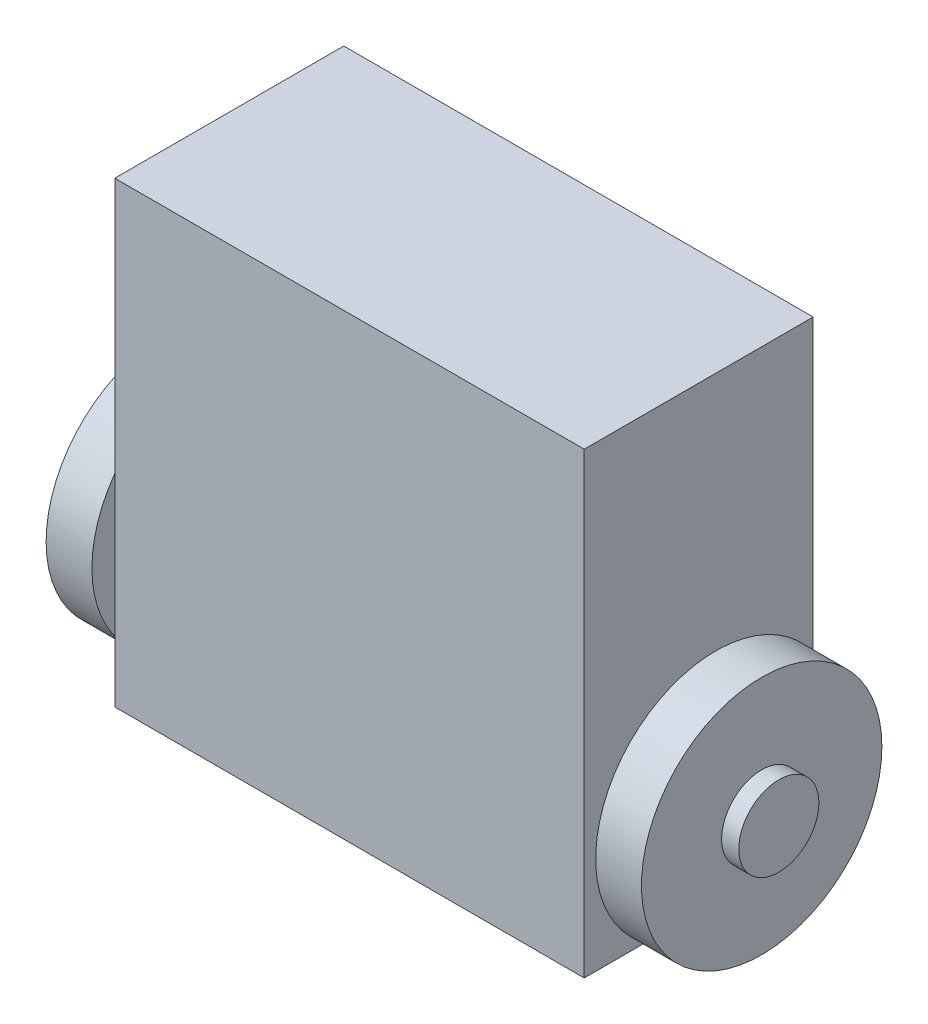
ISO-10303-21;
HEADER;
FILE_DESCRIPTION(('STEP AP214'),'2;1');
FILE_NAME('part.step','',(''),(''),'','','');
FILE_SCHEMA(('AUTOMOTIVE_DESIGN { 1 0 10303 214 1 1 1 1 }'));
ENDSEC;
DATA;
#1=APPLICATION_CONTEXT('core data for automotive mechanical design processes');
#2=APPLICATION_PROTOCOL_DEFINITION('international standard','automotive_design',2000,#1);
#3=PRODUCT_CONTEXT('',#1,'mechanical');
#4=PRODUCT('Part','Part','',(#3));
#5=PRODUCT_RELATED_PRODUCT_CATEGORY('part','',(#4));
#6=PRODUCT_DEFINITION_FORMATION('','',#4);
#7=PRODUCT_DEFINITION_CONTEXT('part definition',#1,'design');
#8=PRODUCT_DEFINITION('design','',#6,#7);
#9=PRODUCT_DEFINITION_SHAPE('','',#8);
#10=(LENGTH_UNIT() NAMED_UNIT(*) SI_UNIT(.MILLI.,.METRE.));
#11=(NAMED_UNIT(*) PLANE_ANGLE_UNIT() SI_UNIT($,.RADIAN.));
#12=(NAMED_UNIT(*) SI_UNIT($,.STERADIAN.) SOLID_ANGLE_UNIT());
#13=UNCERTAINTY_MEASURE_WITH_UNIT(LENGTH_MEASURE(1.E-05),#10,'distance_accuracy_value','');
#14=(GEOMETRIC_REPRESENTATION_CONTEXT(3) GLOBAL_UNCERTAINTY_ASSIGNED_CONTEXT((#13)) GLOBAL_UNIT_ASSIGNED_CONTEXT((#10,
#11,#12)) REPRESENTATION_CONTEXT('',''));
#15=CARTESIAN_POINT('',(0.,0.,0.));
#16=DIRECTION('',(0.,0.,1.));
#17=DIRECTION('',(1.,0.,0.));
#18=AXIS2_PLACEMENT_3D('',#15,#16,#17);
#19=CARTESIAN_POINT('',(20.5,-20.,20.));
#20=DIRECTION('',(-1.,0.,0.));
#21=DIRECTION('',(0.,0.,1.));
#22=AXIS2_PLACEMENT_3D('',#19,#20,#21);
#23=PLANE('',#22);
#24=CARTESIAN_POINT('',(20.5,-10.,10.));
#25=DIRECTION('',(-1.,0.,0.));
#26=DIRECTION('',(0.,0.,1.));
#27=AXIS2_PLACEMENT_3D('',#24,#25,#26);
#28=CIRCLE('',#27,3.5);
#29=CARTESIAN_POINT('',(20.5,-10.,13.5));
#30=VERTEX_POINT('',#29);
#31=EDGE_CURVE('E44',#30,#30,#28,.F.);
#32=ORIENTED_EDGE('',*,*,#31,.F.);
#33=EDGE_LOOP('',(#32));
#34=FACE_BOUND('',#33,.T.);
#35=DIRECTION('',(0.,1.,0.));
#36=VECTOR('',#35,1.);
#37=CARTESIAN_POINT('',(20.5,-20.,0.));
#38=LINE('',#37,#36);
#39=CARTESIAN_POINT('',(20.5,-20.,0.));
#40=VERTEX_POINT('',#39);
#41=CARTESIAN_POINT('',(20.5,20.,0.));
#42=VERTEX_POINT('',#41);
#43=EDGE_CURVE('E103',#40,#42,#38,.T.);
#44=ORIENTED_EDGE('',*,*,#43,.T.);
#45=DIRECTION('',(0.,0.,-1.));
#46=VECTOR('',#45,1.);
#47=CARTESIAN_POINT('',(20.5,20.,20.));
#48=LINE('',#47,#46);
#49=CARTESIAN_POINT('',(20.5,20.,20.));
#50=VERTEX_POINT('',#49);
#51=EDGE_CURVE('E94',#50,#42,#48,.T.);
#52=ORIENTED_EDGE('',*,*,#51,.F.);
#53=DIRECTION('',(0.,1.,0.));
#54=VECTOR('',#53,1.);
#55=CARTESIAN_POINT('',(20.5,-20.,20.));
#56=LINE('',#55,#54);
#57=CARTESIAN_POINT('',(20.5,-20.,20.));
#58=VERTEX_POINT('',#57);
#59=EDGE_CURVE('E88',#58,#50,#56,.T.);
#60=ORIENTED_EDGE('',*,*,#59,.F.);
#61=DIRECTION('',(0.,0.,-1.));
#62=VECTOR('',#61,1.);
#63=CARTESIAN_POINT('',(20.5,-20.,20.));
#64=LINE('',#63,#62);
#65=EDGE_CURVE('E99',#58,#40,#64,.T.);
#66=ORIENTED_EDGE('',*,*,#65,.T.);
#67=EDGE_LOOP('',(#44,#52,#60,#66));
#68=FACE_BOUND('',#67,.T.);
#69=ADVANCED_FACE('F36',(#34,#68),#23,.F.);
#70=CARTESIAN_POINT('',(-20.5,20.,20.));
#71=DIRECTION('',(0.,-1.,0.));
#72=DIRECTION('',(0.,0.,-1.));
#73=AXIS2_PLACEMENT_3D('',#70,#71,#72);
#74=PLANE('',#73);
#75=DIRECTION('',(-1.,0.,0.));
#76=VECTOR('',#75,1.);
#77=CARTESIAN_POINT('',(-20.5,20.,0.));
#78=LINE('',#77,#76);
#79=CARTESIAN_POINT('',(-20.5,20.,0.));
#80=VERTEX_POINT('',#79);
#81=EDGE_CURVE('E93',#42,#80,#78,.T.);
#82=ORIENTED_EDGE('',*,*,#81,.T.);
#83=DIRECTION('',(0.,0.,-1.));
#84=VECTOR('',#83,1.);
#85=CARTESIAN_POINT('',(-20.5,20.,20.));
#86=LINE('',#85,#84);
#87=CARTESIAN_POINT('',(-20.5,20.,20.));
#88=VERTEX_POINT('',#87);
#89=EDGE_CURVE('E91',#88,#80,#86,.T.);
#90=ORIENTED_EDGE('',*,*,#89,.F.);
#91=DIRECTION('',(-1.,0.,0.));
#92=VECTOR('',#91,1.);
#93=CARTESIAN_POINT('',(-20.5,20.,20.));
#94=LINE('',#93,#92);
#95=EDGE_CURVE('E83',#50,#88,#94,.T.);
#96=ORIENTED_EDGE('',*,*,#95,.F.);
#97=ORIENTED_EDGE('',*,*,#51,.T.);
#98=EDGE_LOOP('',(#82,#90,#96,#97));
#99=FACE_BOUND('',#98,.T.);
#100=ADVANCED_FACE('F92',(#99),#74,.F.);
#101=CARTESIAN_POINT('',(-20.5,-20.,20.));
#102=DIRECTION('',(1.,0.,0.));
#103=DIRECTION('',(0.,0.,-1.));
#104=AXIS2_PLACEMENT_3D('',#101,#102,#103);
#105=PLANE('',#104);
#106=CARTESIAN_POINT('',(-20.5,-10.,10.));
#107=DIRECTION('',(1.,0.,0.));
#108=DIRECTION('',(0.,0.,-1.));
#109=AXIS2_PLACEMENT_3D('',#106,#107,#108);
#110=CIRCLE('',#109,3.5);
#111=CARTESIAN_POINT('',(-20.5,-10.,6.5));
#112=VERTEX_POINT('',#111);
#113=EDGE_CURVE('E11',#112,#112,#110,.F.);
#114=ORIENTED_EDGE('',*,*,#113,.F.);
#115=EDGE_LOOP('',(#114));
#116=FACE_BOUND('',#115,.T.);
#117=DIRECTION('',(0.,-1.,0.));
#118=VECTOR('',#117,1.);
#119=CARTESIAN_POINT('',(-20.5,-20.,0.));
#120=LINE('',#119,#118);
#121=CARTESIAN_POINT('',(-20.5,-20.,0.));
#122=VERTEX_POINT('',#121);
#123=EDGE_CURVE('E69',#80,#122,#120,.T.);
#124=ORIENTED_EDGE('',*,*,#123,.T.);
#125=DIRECTION('',(0.,0.,-1.));
#126=VECTOR('',#125,1.);
#127=CARTESIAN_POINT('',(-20.5,-20.,20.));
#128=LINE('',#127,#126);
#129=CARTESIAN_POINT('',(-20.5,-20.,20.));
#130=VERTEX_POINT('',#129);
#131=EDGE_CURVE('E95',#130,#122,#128,.T.);
#132=ORIENTED_EDGE('',*,*,#131,.F.);
#133=DIRECTION('',(0.,-1.,0.));
#134=VECTOR('',#133,1.);
#135=CARTESIAN_POINT('',(-20.5,-20.,20.));
#136=LINE('',#135,#134);
#137=EDGE_CURVE('E86',#88,#130,#136,.T.);
#138=ORIENTED_EDGE('',*,*,#137,.F.);
#139=ORIENTED_EDGE('',*,*,#89,.T.);
#140=EDGE_LOOP('',(#124,#132,#138,#139));
#141=FACE_BOUND('',#140,.T.);
#142=ADVANCED_FACE('F97',(#116,#141),#105,.F.);
#143=CARTESIAN_POINT('',(-20.5,-20.,20.));
#144=DIRECTION('',(0.,1.,0.));
#145=DIRECTION('',(0.,0.,1.));
#146=AXIS2_PLACEMENT_3D('',#143,#144,#145);
#147=PLANE('',#146);
#148=DIRECTION('',(1.,0.,0.));
#149=VECTOR('',#148,1.);
#150=CARTESIAN_POINT('',(-20.5,-20.,0.));
#151=LINE('',#150,#149);
#152=EDGE_CURVE('E75',#122,#40,#151,.T.);
#153=ORIENTED_EDGE('',*,*,#152,.T.);
#154=ORIENTED_EDGE('',*,*,#65,.F.);
#155=DIRECTION('',(1.,0.,0.));
#156=VECTOR('',#155,1.);
#157=CARTESIAN_POINT('',(-20.5,-20.,20.));
#158=LINE('',#157,#156);
#159=EDGE_CURVE('E52',#130,#58,#158,.T.);
#160=ORIENTED_EDGE('',*,*,#159,.F.);
#161=ORIENTED_EDGE('',*,*,#131,.T.);
#162=EDGE_LOOP('',(#153,#154,#160,#161));
#163=FACE_BOUND('',#162,.T.);
#164=ADVANCED_FACE('F131',(#163),#147,.F.);
#165=CARTESIAN_POINT('',(0.,0.,20.));
#166=DIRECTION('',(0.,0.,-1.));
#167=DIRECTION('',(-1.,0.,0.));
#168=AXIS2_PLACEMENT_3D('',#165,#166,#167);
#169=PLANE('',#168);
#170=ORIENTED_EDGE('',*,*,#59,.T.);
#171=ORIENTED_EDGE('',*,*,#95,.T.);
#172=ORIENTED_EDGE('',*,*,#137,.T.);
#173=ORIENTED_EDGE('',*,*,#159,.T.);
#174=EDGE_LOOP('',(#170,#171,#172,#173));
#175=FACE_BOUND('',#174,.T.);
#176=ADVANCED_FACE('F84',(#175),#169,.F.);
#177=CARTESIAN_POINT('',(0.,0.,0.));
#178=DIRECTION('',(0.,0.,-1.));
#179=DIRECTION('',(-1.,0.,0.));
#180=AXIS2_PLACEMENT_3D('',#177,#178,#179);
#181=PLANE('',#180);
#182=ORIENTED_EDGE('',*,*,#43,.F.);
#183=ORIENTED_EDGE('',*,*,#152,.F.);
#184=ORIENTED_EDGE('',*,*,#123,.F.);
#185=ORIENTED_EDGE('',*,*,#81,.F.);
#186=EDGE_LOOP('',(#182,#183,#184,#185));
#187=FACE_BOUND('',#186,.T.);
#188=ADVANCED_FACE('F121',(#187),#181,.T.);
#189=CARTESIAN_POINT('',(22.,-10.,10.));
#190=DIRECTION('',(-1.,0.,0.));
#191=DIRECTION('',(0.,0.,1.));
#192=AXIS2_PLACEMENT_3D('',#189,#190,#191);
#193=CYLINDRICAL_SURFACE('',#192,3.5);
#194=CARTESIAN_POINT('',(22.,-10.,10.));
#195=DIRECTION('',(1.,0.,0.));
#196=DIRECTION('',(0.,0.,-1.));
#197=AXIS2_PLACEMENT_3D('',#194,#195,#196);
#198=CIRCLE('',#197,3.5);
#199=CARTESIAN_POINT('',(22.,-10.,6.5));
#200=VERTEX_POINT('',#199);
#201=EDGE_CURVE('E106',#200,#200,#198,.T.);
#202=ORIENTED_EDGE('',*,*,#201,.F.);
#203=EDGE_LOOP('',(#202));
#204=FACE_BOUND('',#203,.T.);
#205=ORIENTED_EDGE('',*,*,#31,.T.);
#206=EDGE_LOOP('',(#205));
#207=FACE_BOUND('',#206,.T.);
#208=ADVANCED_FACE('F115',(#204,#207),#193,.T.);
#209=CARTESIAN_POINT('',(-22.,-10.,10.));
#210=DIRECTION('',(1.,0.,0.));
#211=DIRECTION('',(0.,0.,-1.));
#212=AXIS2_PLACEMENT_3D('',#209,#210,#211);
#213=CYLINDRICAL_SURFACE('',#212,3.5);
#214=CARTESIAN_POINT('',(-22.,-10.,10.));
#215=DIRECTION('',(-1.,0.,0.));
#216=DIRECTION('',(0.,0.,1.));
#217=AXIS2_PLACEMENT_3D('',#214,#215,#216);
#218=CIRCLE('',#217,3.5);
#219=CARTESIAN_POINT('',(-22.,-10.,13.5));
#220=VERTEX_POINT('',#219);
#221=EDGE_CURVE('E306',#220,#220,#218,.T.);
#222=ORIENTED_EDGE('',*,*,#221,.F.);
#223=EDGE_LOOP('',(#222));
#224=FACE_BOUND('',#223,.T.);
#225=ORIENTED_EDGE('',*,*,#113,.T.);
#226=EDGE_LOOP('',(#225));
#227=FACE_BOUND('',#226,.T.);
#228=ADVANCED_FACE('F128',(#224,#227),#213,.T.);
#229=CARTESIAN_POINT('',(26.,-10.,10.));
#230=DIRECTION('',(-1.,0.,0.));
#231=DIRECTION('',(0.,0.,1.));
#232=AXIS2_PLACEMENT_3D('',#229,#230,#231);
#233=CYLINDRICAL_SURFACE('',#232,10.5);
#234=CARTESIAN_POINT('',(26.,-10.,10.));
#235=DIRECTION('',(1.,0.,0.));
#236=DIRECTION('',(0.,0.,-1.));
#237=AXIS2_PLACEMENT_3D('',#234,#235,#236);
#238=CIRCLE('',#237,10.5);
#239=CARTESIAN_POINT('',(26.,-10.,-0.5));
#240=VERTEX_POINT('',#239);
#241=EDGE_CURVE('E303',#240,#240,#238,.T.);
#242=ORIENTED_EDGE('',*,*,#241,.F.);
#243=EDGE_LOOP('',(#242));
#244=FACE_BOUND('',#243,.T.);
#245=CARTESIAN_POINT('',(22.,-10.,10.));
#246=DIRECTION('',(1.,0.,0.));
#247=DIRECTION('',(0.,0.,-1.));
#248=AXIS2_PLACEMENT_3D('',#245,#246,#247);
#249=CIRCLE('',#248,10.5);
#250=CARTESIAN_POINT('',(22.,-10.,-0.5));
#251=VERTEX_POINT('',#250);
#252=EDGE_CURVE('E300',#251,#251,#249,.T.);
#253=ORIENTED_EDGE('',*,*,#252,.T.);
#254=EDGE_LOOP('',(#253));
#255=FACE_BOUND('',#254,.T.);
#256=ADVANCED_FACE('F178',(#244,#255),#233,.T.);
#257=CARTESIAN_POINT('',(26.,-10.,10.));
#258=DIRECTION('',(1.,0.,0.));
#259=DIRECTION('',(0.,0.,-1.));
#260=AXIS2_PLACEMENT_3D('',#257,#258,#259);
#261=PLANE('',#260);
#262=CARTESIAN_POINT('',(26.,-10.,10.));
#263=DIRECTION('',(1.,0.,0.));
#264=DIRECTION('',(0.,0.,-1.));
#265=AXIS2_PLACEMENT_3D('',#262,#263,#264);
#266=CIRCLE('',#265,3.5);
#267=CARTESIAN_POINT('',(26.,-10.,6.5));
#268=VERTEX_POINT('',#267);
#269=EDGE_CURVE('E286',#268,#268,#266,.T.);
#270=ORIENTED_EDGE('',*,*,#269,.F.);
#271=EDGE_LOOP('',(#270));
#272=FACE_BOUND('',#271,.T.);
#273=ORIENTED_EDGE('',*,*,#241,.T.);
#274=EDGE_LOOP('',(#273));
#275=FACE_BOUND('',#274,.T.);
#276=ADVANCED_FACE('F185',(#272,#275),#261,.T.);
#277=CARTESIAN_POINT('',(22.,-10.,10.));
#278=DIRECTION('',(1.,0.,0.));
#279=DIRECTION('',(0.,0.,-1.));
#280=AXIS2_PLACEMENT_3D('',#277,#278,#279);
#281=PLANE('',#280);
#282=ORIENTED_EDGE('',*,*,#201,.T.);
#283=EDGE_LOOP('',(#282));
#284=FACE_BOUND('',#283,.T.);
#285=ORIENTED_EDGE('',*,*,#252,.F.);
#286=EDGE_LOOP('',(#285));
#287=FACE_BOUND('',#286,.T.);
#288=ADVANCED_FACE('F194',(#284,#287),#281,.F.);
#289=CARTESIAN_POINT('',(-26.,-10.,10.));
#290=DIRECTION('',(1.,0.,0.));
#291=DIRECTION('',(0.,0.,-1.));
#292=AXIS2_PLACEMENT_3D('',#289,#290,#291);
#293=CYLINDRICAL_SURFACE('',#292,10.5);
#294=CARTESIAN_POINT('',(-26.,-10.,10.));
#295=DIRECTION('',(-1.,0.,0.));
#296=DIRECTION('',(0.,0.,1.));
#297=AXIS2_PLACEMENT_3D('',#294,#295,#296);
#298=CIRCLE('',#297,10.5);
#299=CARTESIAN_POINT('',(-26.,-10.,20.5));
#300=VERTEX_POINT('',#299);
#301=EDGE_CURVE('E297',#300,#300,#298,.T.);
#302=ORIENTED_EDGE('',*,*,#301,.F.);
#303=EDGE_LOOP('',(#302));
#304=FACE_BOUND('',#303,.T.);
#305=CARTESIAN_POINT('',(-22.,-10.,10.));
#306=DIRECTION('',(-1.,0.,0.));
#307=DIRECTION('',(0.,0.,1.));
#308=AXIS2_PLACEMENT_3D('',#305,#306,#307);
#309=CIRCLE('',#308,10.5);
#310=CARTESIAN_POINT('',(-22.,-10.,20.5));
#311=VERTEX_POINT('',#310);
#312=EDGE_CURVE('E295',#311,#311,#309,.T.);
#313=ORIENTED_EDGE('',*,*,#312,.T.);
#314=EDGE_LOOP('',(#313));
#315=FACE_BOUND('',#314,.T.);
#316=ADVANCED_FACE('F203',(#304,#315),#293,.T.);
#317=CARTESIAN_POINT('',(-26.,-10.,10.));
#318=DIRECTION('',(-1.,0.,0.));
#319=DIRECTION('',(0.,0.,1.));
#320=AXIS2_PLACEMENT_3D('',#317,#318,#319);
#321=PLANE('',#320);
#322=CARTESIAN_POINT('',(-26.,-10.,10.));
#323=DIRECTION('',(-1.,0.,0.));
#324=DIRECTION('',(0.,0.,1.));
#325=AXIS2_PLACEMENT_3D('',#322,#323,#324);
#326=CIRCLE('',#325,3.5);
#327=CARTESIAN_POINT('',(-26.,-10.,13.5));
#328=VERTEX_POINT('',#327);
#329=EDGE_CURVE('E285',#328,#328,#326,.T.);
#330=ORIENTED_EDGE('',*,*,#329,.F.);
#331=EDGE_LOOP('',(#330));
#332=FACE_BOUND('',#331,.T.);
#333=ORIENTED_EDGE('',*,*,#301,.T.);
#334=EDGE_LOOP('',(#333));
#335=FACE_BOUND('',#334,.T.);
#336=ADVANCED_FACE('F211',(#332,#335),#321,.T.);
#337=CARTESIAN_POINT('',(-22.,-10.,10.));
#338=DIRECTION('',(-1.,0.,0.));
#339=DIRECTION('',(0.,0.,1.));
#340=AXIS2_PLACEMENT_3D('',#337,#338,#339);
#341=PLANE('',#340);
#342=ORIENTED_EDGE('',*,*,#221,.T.);
#343=EDGE_LOOP('',(#342));
#344=FACE_BOUND('',#343,.T.);
#345=ORIENTED_EDGE('',*,*,#312,.F.);
#346=EDGE_LOOP('',(#345));
#347=FACE_BOUND('',#346,.T.);
#348=ADVANCED_FACE('F220',(#344,#347),#341,.F.);
#349=CARTESIAN_POINT('',(-27.5,-10.,10.));
#350=DIRECTION('',(1.,0.,0.));
#351=DIRECTION('',(0.,0.,-1.));
#352=AXIS2_PLACEMENT_3D('',#349,#350,#351);
#353=CYLINDRICAL_SURFACE('',#352,3.5);
#354=CARTESIAN_POINT('',(-27.5,-10.,10.));
#355=DIRECTION('',(-1.,0.,0.));
#356=DIRECTION('',(0.,0.,1.));
#357=AXIS2_PLACEMENT_3D('',#354,#355,#356);
#358=CIRCLE('',#357,3.5);
#359=CARTESIAN_POINT('',(-27.5,-10.,13.5));
#360=VERTEX_POINT('',#359);
#361=EDGE_CURVE('E289',#360,#360,#358,.T.);
#362=ORIENTED_EDGE('',*,*,#361,.F.);
#363=EDGE_LOOP('',(#362));
#364=FACE_BOUND('',#363,.T.);
#365=ORIENTED_EDGE('',*,*,#329,.T.);
#366=EDGE_LOOP('',(#365));
#367=FACE_BOUND('',#366,.T.);
#368=ADVANCED_FACE('F228',(#364,#367),#353,.T.);
#369=CARTESIAN_POINT('',(-27.5,-10.,10.));
#370=DIRECTION('',(-1.,0.,0.));
#371=DIRECTION('',(0.,0.,1.));
#372=AXIS2_PLACEMENT_3D('',#369,#370,#371);
#373=PLANE('',#372);
#374=ORIENTED_EDGE('',*,*,#361,.T.);
#375=EDGE_LOOP('',(#374));
#376=FACE_BOUND('',#375,.T.);
#377=ADVANCED_FACE('F235',(#376),#373,.T.);
#378=CARTESIAN_POINT('',(27.5,-10.,10.));
#379=DIRECTION('',(-1.,0.,0.));
#380=DIRECTION('',(0.,0.,1.));
#381=AXIS2_PLACEMENT_3D('',#378,#379,#380);
#382=CYLINDRICAL_SURFACE('',#381,3.5);
#383=CARTESIAN_POINT('',(27.5,-10.,10.));
#384=DIRECTION('',(1.,0.,0.));
#385=DIRECTION('',(0.,0.,-1.));
#386=AXIS2_PLACEMENT_3D('',#383,#384,#385);
#387=CIRCLE('',#386,3.5);
#388=CARTESIAN_POINT('',(27.5,-10.,6.5));
#389=VERTEX_POINT('',#388);
#390=EDGE_CURVE('E284',#389,#389,#387,.T.);
#391=ORIENTED_EDGE('',*,*,#390,.F.);
#392=EDGE_LOOP('',(#391));
#393=FACE_BOUND('',#392,.T.);
#394=ORIENTED_EDGE('',*,*,#269,.T.);
#395=EDGE_LOOP('',(#394));
#396=FACE_BOUND('',#395,.T.);
#397=ADVANCED_FACE('F242',(#393,#396),#382,.T.);
#398=CARTESIAN_POINT('',(27.5,-10.,10.));
#399=DIRECTION('',(1.,0.,0.));
#400=DIRECTION('',(0.,0.,-1.));
#401=AXIS2_PLACEMENT_3D('',#398,#399,#400);
#402=PLANE('',#401);
#403=ORIENTED_EDGE('',*,*,#390,.T.);
#404=EDGE_LOOP('',(#403));
#405=FACE_BOUND('',#404,.T.);
#406=ADVANCED_FACE('F249',(#405),#402,.T.);
#407=CLOSED_SHELL('',(#69,#100,#142,#164,#176,#188,#208,#228,#256,#276,#288,#316,#336,#348,#368,
#377,#397,#406));
#408=MANIFOLD_SOLID_BREP('B2',#407);
#409=ADVANCED_BREP_SHAPE_REPRESENTATION('',(#18,#408),#14);
#410=SHAPE_DEFINITION_REPRESENTATION(#9,#409);
ENDSEC;
END-ISO-10303-21;
